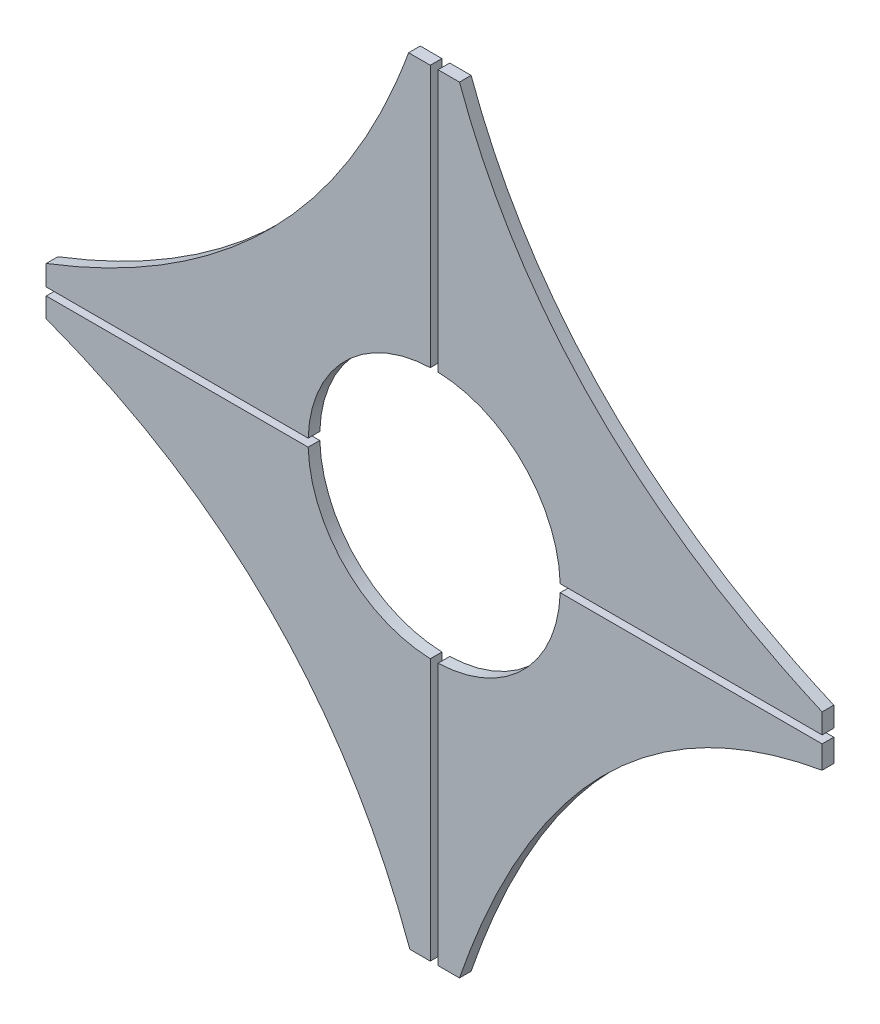
ISO-10303-21;
HEADER;
FILE_DESCRIPTION(('STEP AP214'),'2;1');
FILE_NAME('part.step','',(''),(''),'','','');
FILE_SCHEMA(('AUTOMOTIVE_DESIGN { 1 0 10303 214 1 1 1 1 }'));
ENDSEC;
DATA;
#1=APPLICATION_CONTEXT('core data for automotive mechanical design processes');
#2=APPLICATION_PROTOCOL_DEFINITION('international standard','automotive_design',2000,#1);
#3=PRODUCT_CONTEXT('',#1,'mechanical');
#4=PRODUCT('Part','Part','',(#3));
#5=PRODUCT_RELATED_PRODUCT_CATEGORY('part','',(#4));
#6=PRODUCT_DEFINITION_FORMATION('','',#4);
#7=PRODUCT_DEFINITION_CONTEXT('part definition',#1,'design');
#8=PRODUCT_DEFINITION('design','',#6,#7);
#9=PRODUCT_DEFINITION_SHAPE('','',#8);
#10=(LENGTH_UNIT() NAMED_UNIT(*) SI_UNIT(.MILLI.,.METRE.));
#11=(NAMED_UNIT(*) PLANE_ANGLE_UNIT() SI_UNIT($,.RADIAN.));
#12=(NAMED_UNIT(*) SI_UNIT($,.STERADIAN.) SOLID_ANGLE_UNIT());
#13=UNCERTAINTY_MEASURE_WITH_UNIT(LENGTH_MEASURE(1.E-05),#10,'distance_accuracy_value','');
#14=(GEOMETRIC_REPRESENTATION_CONTEXT(3) GLOBAL_UNCERTAINTY_ASSIGNED_CONTEXT((#13)) GLOBAL_UNIT_ASSIGNED_CONTEXT((#10,
#11,#12)) REPRESENTATION_CONTEXT('',''));
#15=CARTESIAN_POINT('',(0.,0.,0.));
#16=DIRECTION('',(0.,0.,1.));
#17=DIRECTION('',(1.,0.,0.));
#18=AXIS2_PLACEMENT_3D('',#15,#16,#17);
#19=CARTESIAN_POINT('',(-82.7092824955107,-71.5253229127844,3.));
#20=DIRECTION('',(0.,1.,0.));
#21=DIRECTION('',(0.,0.,1.));
#22=AXIS2_PLACEMENT_3D('',#19,#20,#21);
#23=PLANE('',#22);
#24=DIRECTION('',(1.,0.,0.));
#25=VECTOR('',#24,1.);
#26=CARTESIAN_POINT('',(-82.7092824955107,-71.5253229127844,0.));
#27=LINE('',#26,#25);
#28=CARTESIAN_POINT('',(18.2907175044893,-71.5253229127844,0.));
#29=VERTEX_POINT('',#28);
#30=CARTESIAN_POINT('',(23.8097697131968,-71.5253229127844,0.));
#31=VERTEX_POINT('',#30);
#32=EDGE_CURVE('E119',#29,#31,#27,.T.);
#33=ORIENTED_EDGE('',*,*,#32,.T.);
#34=DIRECTION('',(0.,0.,1.));
#35=VECTOR('',#34,1.);
#36=CARTESIAN_POINT('',(23.8097697131968,-71.5253229127844,-7.));
#37=LINE('',#36,#35);
#38=CARTESIAN_POINT('',(23.8097697131968,-71.5253229127844,3.));
#39=VERTEX_POINT('',#38);
#40=EDGE_CURVE('E63',#31,#39,#37,.T.);
#41=ORIENTED_EDGE('',*,*,#40,.T.);
#42=DIRECTION('',(1.,0.,0.));
#43=VECTOR('',#42,1.);
#44=CARTESIAN_POINT('',(-82.7092824955107,-71.5253229127844,3.));
#45=LINE('',#44,#43);
#46=CARTESIAN_POINT('',(18.2907175044893,-71.5253229127844,3.));
#47=VERTEX_POINT('',#46);
#48=EDGE_CURVE('E117',#47,#39,#45,.T.);
#49=ORIENTED_EDGE('',*,*,#48,.F.);
#50=DIRECTION('',(0.,0.,1.));
#51=VECTOR('',#50,1.);
#52=CARTESIAN_POINT('',(18.2907175044893,-71.5253229127844,-7.));
#53=LINE('',#52,#51);
#54=EDGE_CURVE('E94',#29,#47,#53,.T.);
#55=ORIENTED_EDGE('',*,*,#54,.F.);
#56=EDGE_LOOP('',(#33,#41,#49,#55));
#57=FACE_BOUND('',#56,.T.);
#58=ADVANCED_FACE('F48',(#57),#23,.F.);
#59=CARTESIAN_POINT('',(117.290717504489,128.474677087216,3.));
#60=DIRECTION('',(1.,0.,0.));
#61=DIRECTION('',(0.,1.,0.));
#62=AXIS2_PLACEMENT_3D('',#59,#60,#61);
#63=PLANE('',#62);
#64=DIRECTION('',(0.,0.,1.));
#65=VECTOR('',#64,1.);
#66=CARTESIAN_POINT('',(117.290717504489,21.5866219232985,-7.));
#67=LINE('',#66,#65);
#68=CARTESIAN_POINT('',(117.290717504489,21.5866219232985,0.));
#69=VERTEX_POINT('',#68);
#70=CARTESIAN_POINT('',(117.290717504489,21.5866219232985,3.));
#71=VERTEX_POINT('',#70);
#72=EDGE_CURVE('E108',#69,#71,#67,.T.);
#73=ORIENTED_EDGE('',*,*,#72,.F.);
#74=DIRECTION('',(0.,-1.,0.));
#75=VECTOR('',#74,1.);
#76=CARTESIAN_POINT('',(117.290717504489,128.474677087216,0.));
#77=LINE('',#76,#75);
#78=CARTESIAN_POINT('',(117.290717504489,27.4746770872157,0.));
#79=VERTEX_POINT('',#78);
#80=EDGE_CURVE('E123',#79,#69,#77,.T.);
#81=ORIENTED_EDGE('',*,*,#80,.F.);
#82=DIRECTION('',(0.,0.,1.));
#83=VECTOR('',#82,1.);
#84=CARTESIAN_POINT('',(117.290717504489,27.4746770872157,-7.));
#85=LINE('',#84,#83);
#86=CARTESIAN_POINT('',(117.290717504489,27.4746770872157,3.));
#87=VERTEX_POINT('',#86);
#88=EDGE_CURVE('E72',#79,#87,#85,.T.);
#89=ORIENTED_EDGE('',*,*,#88,.T.);
#90=DIRECTION('',(0.,-1.,0.));
#91=VECTOR('',#90,1.);
#92=CARTESIAN_POINT('',(117.290717504489,128.474677087216,3.));
#93=LINE('',#92,#91);
#94=EDGE_CURVE('E124',#87,#71,#93,.T.);
#95=ORIENTED_EDGE('',*,*,#94,.T.);
#96=EDGE_LOOP('',(#73,#81,#89,#95));
#97=FACE_BOUND('',#96,.T.);
#98=ADVANCED_FACE('F155',(#97),#63,.T.);
#99=CARTESIAN_POINT('',(0.,0.,3.));
#100=DIRECTION('',(0.,0.,-1.));
#101=DIRECTION('',(-1.,0.,0.));
#102=AXIS2_PLACEMENT_3D('',#99,#100,#101);
#103=PLANE('',#102);
#104=ORIENTED_EDGE('',*,*,#48,.T.);
#105=CARTESIAN_POINT('',(117.290717504489,21.5866219232985,3.));
#106=CARTESIAN_POINT('',(51.8516741059689,10.0479529803876,3.));
#107=CARTESIAN_POINT('',(23.8097697131967,-71.5253229127845,3.));
#108=B_SPLINE_CURVE_WITH_KNOTS('',2,(#105,#106,#107),.UNSPECIFIED.,.F.,.F.,(3,3),(0.,1.),.UNSPECIFIED.);
#109=EDGE_CURVE('E105',#71,#39,#108,.T.);
#110=ORIENTED_EDGE('',*,*,#109,.F.);
#111=ORIENTED_EDGE('',*,*,#94,.F.);
#112=DIRECTION('',(1.,0.,0.));
#113=VECTOR('',#112,1.);
#114=CARTESIAN_POINT('',(117.290717504489,27.4746770872157,3.));
#115=LINE('',#114,#113);
#116=CARTESIAN_POINT('',(49.7753292460509,27.4746770872156,3.));
#117=VERTEX_POINT('',#116);
#118=EDGE_CURVE('E57',#117,#87,#115,.T.);
#119=ORIENTED_EDGE('',*,*,#118,.F.);
#120=CARTESIAN_POINT('',(17.2907175044893,28.4746770872157,3.));
#121=DIRECTION('',(0.,0.,1.));
#122=DIRECTION('',(1.,0.,0.));
#123=AXIS2_PLACEMENT_3D('',#120,#121,#122);
#124=CIRCLE('',#123,32.5);
#125=CARTESIAN_POINT('',(18.2907175044893,-4.00993465434592,3.));
#126=VERTEX_POINT('',#125);
#127=EDGE_CURVE('E127',#126,#117,#124,.T.);
#128=ORIENTED_EDGE('',*,*,#127,.F.);
#129=DIRECTION('',(0.,1.,0.));
#130=VECTOR('',#129,1.);
#131=CARTESIAN_POINT('',(18.2907175044893,6.09988475740631,3.));
#132=LINE('',#131,#130);
#133=EDGE_CURVE('E96',#47,#126,#132,.T.);
#134=ORIENTED_EDGE('',*,*,#133,.F.);
#135=EDGE_LOOP('',(#104,#110,#111,#119,#128,#134));
#136=FACE_BOUND('',#135,.T.);
#137=ADVANCED_FACE('F121',(#136),#103,.F.);
#138=CARTESIAN_POINT('',(0.,0.,0.));
#139=DIRECTION('',(0.,0.,-1.));
#140=DIRECTION('',(-1.,0.,0.));
#141=AXIS2_PLACEMENT_3D('',#138,#139,#140);
#142=PLANE('',#141);
#143=CARTESIAN_POINT('',(117.290717504489,21.5866219232985,0.));
#144=CARTESIAN_POINT('',(51.8516741059689,10.0479529803876,0.));
#145=CARTESIAN_POINT('',(23.8097697131967,-71.5253229127845,0.));
#146=B_SPLINE_CURVE_WITH_KNOTS('',2,(#143,#144,#145),.UNSPECIFIED.,.F.,.F.,(3,3),(0.,1.),.UNSPECIFIED.);
#147=EDGE_CURVE('E12',#31,#69,#146,.F.);
#148=ORIENTED_EDGE('',*,*,#147,.F.);
#149=ORIENTED_EDGE('',*,*,#32,.F.);
#150=DIRECTION('',(0.,-1.,0.));
#151=VECTOR('',#150,1.);
#152=CARTESIAN_POINT('',(18.2907175044893,0.,0.));
#153=LINE('',#152,#151);
#154=CARTESIAN_POINT('',(18.2907175044893,-4.00993465434592,0.));
#155=VERTEX_POINT('',#154);
#156=EDGE_CURVE('E140',#155,#29,#153,.T.);
#157=ORIENTED_EDGE('',*,*,#156,.F.);
#158=CARTESIAN_POINT('',(17.2907175044893,28.4746770872157,0.));
#159=DIRECTION('',(0.,0.,-1.));
#160=DIRECTION('',(-1.,0.,0.));
#161=AXIS2_PLACEMENT_3D('',#158,#159,#160);
#162=CIRCLE('',#161,32.5);
#163=CARTESIAN_POINT('',(49.7753292460509,27.4746770872156,0.));
#164=VERTEX_POINT('',#163);
#165=EDGE_CURVE('E134',#164,#155,#162,.T.);
#166=ORIENTED_EDGE('',*,*,#165,.F.);
#167=DIRECTION('',(-1.,0.,0.));
#168=VECTOR('',#167,1.);
#169=CARTESIAN_POINT('',(0.,27.4746770872156,0.));
#170=LINE('',#169,#168);
#171=EDGE_CURVE('E145',#79,#164,#170,.T.);
#172=ORIENTED_EDGE('',*,*,#171,.F.);
#173=ORIENTED_EDGE('',*,*,#80,.T.);
#174=EDGE_LOOP('',(#148,#149,#157,#166,#172,#173));
#175=FACE_BOUND('',#174,.T.);
#176=ADVANCED_FACE('F157',(#175),#142,.T.);
#177=CARTESIAN_POINT('',(17.2907175044893,28.4746770872157,-7.));
#178=DIRECTION('',(0.,0.,1.));
#179=DIRECTION('',(1.,0.,0.));
#180=AXIS2_PLACEMENT_3D('',#177,#178,#179);
#181=CYLINDRICAL_SURFACE('',#180,32.5);
#182=ORIENTED_EDGE('',*,*,#127,.T.);
#183=DIRECTION('',(0.,0.,1.));
#184=VECTOR('',#183,1.);
#185=CARTESIAN_POINT('',(49.7753292460509,27.4746770872156,-7.));
#186=LINE('',#185,#184);
#187=EDGE_CURVE('E133',#117,#164,#186,.F.);
#188=ORIENTED_EDGE('',*,*,#187,.T.);
#189=ORIENTED_EDGE('',*,*,#165,.T.);
#190=DIRECTION('',(0.,0.,1.));
#191=VECTOR('',#190,1.);
#192=CARTESIAN_POINT('',(18.2907175044893,-4.00993465434592,-7.));
#193=LINE('',#192,#191);
#194=EDGE_CURVE('E136',#155,#126,#193,.T.);
#195=ORIENTED_EDGE('',*,*,#194,.T.);
#196=EDGE_LOOP('',(#182,#188,#189,#195));
#197=FACE_BOUND('',#196,.T.);
#198=ADVANCED_FACE('F160',(#197),#181,.F.);
#199=CARTESIAN_POINT('',(18.2907175044893,6.09988475740631,-7.));
#200=DIRECTION('',(1.,0.,0.));
#201=DIRECTION('',(0.,1.,0.));
#202=AXIS2_PLACEMENT_3D('',#199,#200,#201);
#203=PLANE('',#202);
#204=ORIENTED_EDGE('',*,*,#156,.T.);
#205=ORIENTED_EDGE('',*,*,#54,.T.);
#206=ORIENTED_EDGE('',*,*,#133,.T.);
#207=ORIENTED_EDGE('',*,*,#194,.F.);
#208=EDGE_LOOP('',(#204,#205,#206,#207));
#209=FACE_BOUND('',#208,.T.);
#210=ADVANCED_FACE('F159',(#209),#203,.F.);
#211=CARTESIAN_POINT('',(117.290717504489,27.4746770872157,-7.));
#212=DIRECTION('',(0.,-1.,0.));
#213=DIRECTION('',(1.,0.,0.));
#214=AXIS2_PLACEMENT_3D('',#211,#212,#213);
#215=PLANE('',#214);
#216=ORIENTED_EDGE('',*,*,#171,.T.);
#217=ORIENTED_EDGE('',*,*,#187,.F.);
#218=ORIENTED_EDGE('',*,*,#118,.T.);
#219=ORIENTED_EDGE('',*,*,#88,.F.);
#220=EDGE_LOOP('',(#216,#217,#218,#219));
#221=FACE_BOUND('',#220,.T.);
#222=ADVANCED_FACE('F152',(#221),#215,.F.);
#223=CARTESIAN_POINT('',(117.290717504489,21.5866219232985,-7.));
#224=CARTESIAN_POINT('',(51.8516741059689,10.0479529803876,-7.));
#225=CARTESIAN_POINT('',(23.8097697131967,-71.5253229127845,-7.));
#226=B_SPLINE_CURVE_WITH_KNOTS('',2,(#223,#224,#225),.UNSPECIFIED.,.F.,.F.,(3,3),(0.,1.),.UNSPECIFIED.);
#227=DIRECTION('',(0.,0.,1.));
#228=VECTOR('',#227,1.);
#229=SURFACE_OF_LINEAR_EXTRUSION('',#226,#228);
#230=ORIENTED_EDGE('',*,*,#147,.T.);
#231=ORIENTED_EDGE('',*,*,#72,.T.);
#232=ORIENTED_EDGE('',*,*,#109,.T.);
#233=ORIENTED_EDGE('',*,*,#40,.F.);
#234=EDGE_LOOP('',(#230,#231,#232,#233));
#235=FACE_BOUND('',#234,.T.);
#236=ADVANCED_FACE('F106',(#235),#229,.F.);
#237=CLOSED_SHELL('',(#58,#98,#137,#176,#198,#210,#222,#236));
#238=MANIFOLD_SOLID_BREP('B2',#237);
#239=CARTESIAN_POINT('',(17.2907175044893,28.4746770872157,-7.));
#240=DIRECTION('',(0.,0.,1.));
#241=DIRECTION('',(1.,0.,0.));
#242=AXIS2_PLACEMENT_3D('',#239,#240,#241);
#243=CYLINDRICAL_SURFACE('',#242,32.5);
#244=CARTESIAN_POINT('',(17.2907175044893,28.4746770872157,0.));
#245=DIRECTION('',(0.,0.,-1.));
#246=DIRECTION('',(-1.,0.,0.));
#247=AXIS2_PLACEMENT_3D('',#244,#245,#246);
#248=CIRCLE('',#247,32.5);
#249=CARTESIAN_POINT('',(16.2907175044893,-4.00993465434592,0.));
#250=VERTEX_POINT('',#249);
#251=CARTESIAN_POINT('',(-15.1938942370723,27.4746770872156,0.));
#252=VERTEX_POINT('',#251);
#253=EDGE_CURVE('E325',#250,#252,#248,.T.);
#254=ORIENTED_EDGE('',*,*,#253,.T.);
#255=DIRECTION('',(0.,0.,1.));
#256=VECTOR('',#255,1.);
#257=CARTESIAN_POINT('',(-15.1938942370723,27.4746770872156,-7.));
#258=LINE('',#257,#256);
#259=CARTESIAN_POINT('',(-15.1938942370723,27.4746770872156,3.));
#260=VERTEX_POINT('',#259);
#261=EDGE_CURVE('E274',#252,#260,#258,.T.);
#262=ORIENTED_EDGE('',*,*,#261,.T.);
#263=CARTESIAN_POINT('',(17.2907175044893,28.4746770872157,3.));
#264=DIRECTION('',(0.,0.,1.));
#265=DIRECTION('',(1.,0.,0.));
#266=AXIS2_PLACEMENT_3D('',#263,#264,#265);
#267=CIRCLE('',#266,32.5);
#268=CARTESIAN_POINT('',(16.2907175044893,-4.00993465434592,3.));
#269=VERTEX_POINT('',#268);
#270=EDGE_CURVE('E310',#260,#269,#267,.T.);
#271=ORIENTED_EDGE('',*,*,#270,.T.);
#272=DIRECTION('',(0.,0.,1.));
#273=VECTOR('',#272,1.);
#274=CARTESIAN_POINT('',(16.2907175044893,-4.00993465434592,-7.));
#275=LINE('',#274,#273);
#276=EDGE_CURVE('E316',#269,#250,#275,.F.);
#277=ORIENTED_EDGE('',*,*,#276,.T.);
#278=EDGE_LOOP('',(#254,#262,#271,#277));
#279=FACE_BOUND('',#278,.T.);
#280=ADVANCED_FACE('F251',(#279),#243,.F.);
#281=CARTESIAN_POINT('',(0.,0.,0.));
#282=DIRECTION('',(0.,0.,-1.));
#283=DIRECTION('',(-1.,0.,0.));
#284=AXIS2_PLACEMENT_3D('',#281,#282,#283);
#285=PLANE('',#284);
#286=CARTESIAN_POINT('',(11.0176672659218,-71.5253229127844,0.));
#287=CARTESIAN_POINT('',(-13.8242119253943,-3.27282077782295,0.));
#288=CARTESIAN_POINT('',(-82.7092824955107,22.3246278337182,0.));
#289=B_SPLINE_CURVE_WITH_KNOTS('',2,(#286,#287,#288),.UNSPECIFIED.,.F.,.F.,(3,3),(0.,1.),.UNSPECIFIED.);
#290=CARTESIAN_POINT('',(-82.7092824955107,22.3246278337182,0.));
#291=VERTEX_POINT('',#290);
#292=CARTESIAN_POINT('',(11.0176672659218,-71.5253229127844,0.));
#293=VERTEX_POINT('',#292);
#294=EDGE_CURVE('E266',#291,#293,#289,.F.);
#295=ORIENTED_EDGE('',*,*,#294,.F.);
#296=DIRECTION('',(0.,-1.,0.));
#297=VECTOR('',#296,1.);
#298=CARTESIAN_POINT('',(-82.7092824955107,128.474677087216,0.));
#299=LINE('',#298,#297);
#300=CARTESIAN_POINT('',(-82.7092824955107,27.4746770872156,0.));
#301=VERTEX_POINT('',#300);
#302=EDGE_CURVE('E318',#301,#291,#299,.T.);
#303=ORIENTED_EDGE('',*,*,#302,.F.);
#304=DIRECTION('',(-1.,0.,0.));
#305=VECTOR('',#304,1.);
#306=CARTESIAN_POINT('',(0.,27.4746770872156,0.));
#307=LINE('',#306,#305);
#308=EDGE_CURVE('E296',#252,#301,#307,.T.);
#309=ORIENTED_EDGE('',*,*,#308,.F.);
#310=ORIENTED_EDGE('',*,*,#253,.F.);
#311=DIRECTION('',(0.,1.,0.));
#312=VECTOR('',#311,1.);
#313=CARTESIAN_POINT('',(16.2907175044893,0.,0.));
#314=LINE('',#313,#312);
#315=CARTESIAN_POINT('',(16.2907175044893,-71.5253229127844,0.));
#316=VERTEX_POINT('',#315);
#317=EDGE_CURVE('E338',#316,#250,#314,.T.);
#318=ORIENTED_EDGE('',*,*,#317,.F.);
#319=DIRECTION('',(1.,0.,0.));
#320=VECTOR('',#319,1.);
#321=CARTESIAN_POINT('',(-82.7092824955107,-71.5253229127844,0.));
#322=LINE('',#321,#320);
#323=EDGE_CURVE('E324',#293,#316,#322,.T.);
#324=ORIENTED_EDGE('',*,*,#323,.F.);
#325=EDGE_LOOP('',(#295,#303,#309,#310,#318,#324));
#326=FACE_BOUND('',#325,.T.);
#327=ADVANCED_FACE('F354',(#326),#285,.T.);
#328=CARTESIAN_POINT('',(0.,0.,3.));
#329=DIRECTION('',(0.,0.,-1.));
#330=DIRECTION('',(-1.,0.,0.));
#331=AXIS2_PLACEMENT_3D('',#328,#329,#330);
#332=PLANE('',#331);
#333=DIRECTION('',(0.,-1.,0.));
#334=VECTOR('',#333,1.);
#335=CARTESIAN_POINT('',(-82.7092824955107,128.474677087216,3.));
#336=LINE('',#335,#334);
#337=CARTESIAN_POINT('',(-82.7092824955107,27.4746770872156,3.));
#338=VERTEX_POINT('',#337);
#339=CARTESIAN_POINT('',(-82.7092824955107,22.3246278337182,3.));
#340=VERTEX_POINT('',#339);
#341=EDGE_CURVE('E307',#338,#340,#336,.T.);
#342=ORIENTED_EDGE('',*,*,#341,.T.);
#343=CARTESIAN_POINT('',(11.0176672659218,-71.5253229127844,3.));
#344=CARTESIAN_POINT('',(-13.8242119253943,-3.27282077782295,3.));
#345=CARTESIAN_POINT('',(-82.7092824955107,22.3246278337182,3.));
#346=B_SPLINE_CURVE_WITH_KNOTS('',2,(#343,#344,#345),.UNSPECIFIED.,.F.,.F.,(3,3),(0.,1.),.UNSPECIFIED.);
#347=CARTESIAN_POINT('',(11.0176672659218,-71.5253229127844,3.));
#348=VERTEX_POINT('',#347);
#349=EDGE_CURVE('E378',#348,#340,#346,.T.);
#350=ORIENTED_EDGE('',*,*,#349,.F.);
#351=DIRECTION('',(1.,0.,0.));
#352=VECTOR('',#351,1.);
#353=CARTESIAN_POINT('',(-82.7092824955107,-71.5253229127844,3.));
#354=LINE('',#353,#352);
#355=CARTESIAN_POINT('',(16.2907175044893,-71.5253229127844,3.));
#356=VERTEX_POINT('',#355);
#357=EDGE_CURVE('E315',#348,#356,#354,.T.);
#358=ORIENTED_EDGE('',*,*,#357,.T.);
#359=DIRECTION('',(0.,-1.,0.));
#360=VECTOR('',#359,1.);
#361=CARTESIAN_POINT('',(16.2907175044893,-71.5253229127844,3.));
#362=LINE('',#361,#360);
#363=EDGE_CURVE('E337',#269,#356,#362,.T.);
#364=ORIENTED_EDGE('',*,*,#363,.F.);
#365=ORIENTED_EDGE('',*,*,#270,.F.);
#366=DIRECTION('',(1.,0.,0.));
#367=VECTOR('',#366,1.);
#368=CARTESIAN_POINT('',(-7.92446103112326,27.4746770872156,3.));
#369=LINE('',#368,#367);
#370=EDGE_CURVE('E259',#338,#260,#369,.T.);
#371=ORIENTED_EDGE('',*,*,#370,.F.);
#372=EDGE_LOOP('',(#342,#350,#358,#364,#365,#371));
#373=FACE_BOUND('',#372,.T.);
#374=ADVANCED_FACE('F253',(#373),#332,.F.);
#375=CARTESIAN_POINT('',(-82.7092824955107,128.474677087216,3.));
#376=DIRECTION('',(1.,0.,0.));
#377=DIRECTION('',(0.,1.,0.));
#378=AXIS2_PLACEMENT_3D('',#375,#376,#377);
#379=PLANE('',#378);
#380=ORIENTED_EDGE('',*,*,#302,.T.);
#381=DIRECTION('',(0.,0.,1.));
#382=VECTOR('',#381,1.);
#383=CARTESIAN_POINT('',(-82.7092824955107,22.3246278337182,-7.));
#384=LINE('',#383,#382);
#385=EDGE_CURVE('E314',#291,#340,#384,.T.);
#386=ORIENTED_EDGE('',*,*,#385,.T.);
#387=ORIENTED_EDGE('',*,*,#341,.F.);
#388=DIRECTION('',(0.,0.,1.));
#389=VECTOR('',#388,1.);
#390=CARTESIAN_POINT('',(-82.7092824955107,27.4746770872156,-7.));
#391=LINE('',#390,#389);
#392=EDGE_CURVE('E293',#301,#338,#391,.T.);
#393=ORIENTED_EDGE('',*,*,#392,.F.);
#394=EDGE_LOOP('',(#380,#386,#387,#393));
#395=FACE_BOUND('',#394,.T.);
#396=ADVANCED_FACE('F313',(#395),#379,.F.);
#397=CARTESIAN_POINT('',(-82.7092824955107,-71.5253229127844,3.));
#398=DIRECTION('',(0.,1.,0.));
#399=DIRECTION('',(0.,0.,1.));
#400=AXIS2_PLACEMENT_3D('',#397,#398,#399);
#401=PLANE('',#400);
#402=ORIENTED_EDGE('',*,*,#357,.F.);
#403=DIRECTION('',(0.,0.,1.));
#404=VECTOR('',#403,1.);
#405=CARTESIAN_POINT('',(11.0176672659218,-71.5253229127844,-7.));
#406=LINE('',#405,#404);
#407=EDGE_CURVE('E46',#348,#293,#406,.F.);
#408=ORIENTED_EDGE('',*,*,#407,.T.);
#409=ORIENTED_EDGE('',*,*,#323,.T.);
#410=DIRECTION('',(0.,0.,1.));
#411=VECTOR('',#410,1.);
#412=CARTESIAN_POINT('',(16.2907175044893,-71.5253229127844,-7.));
#413=LINE('',#412,#411);
#414=EDGE_CURVE('E334',#316,#356,#413,.T.);
#415=ORIENTED_EDGE('',*,*,#414,.T.);
#416=EDGE_LOOP('',(#402,#408,#409,#415));
#417=FACE_BOUND('',#416,.T.);
#418=ADVANCED_FACE('F350',(#417),#401,.F.);
#419=CARTESIAN_POINT('',(16.2907175044893,-71.5253229127844,-7.));
#420=DIRECTION('',(-1.,0.,0.));
#421=DIRECTION('',(0.,0.,1.));
#422=AXIS2_PLACEMENT_3D('',#419,#420,#421);
#423=PLANE('',#422);
#424=ORIENTED_EDGE('',*,*,#317,.T.);
#425=ORIENTED_EDGE('',*,*,#276,.F.);
#426=ORIENTED_EDGE('',*,*,#363,.T.);
#427=ORIENTED_EDGE('',*,*,#414,.F.);
#428=EDGE_LOOP('',(#424,#425,#426,#427));
#429=FACE_BOUND('',#428,.T.);
#430=ADVANCED_FACE('F346',(#429),#423,.F.);
#431=CARTESIAN_POINT('',(-7.92446103112326,27.4746770872156,-7.));
#432=DIRECTION('',(0.,-1.,0.));
#433=DIRECTION('',(1.,0.,0.));
#434=AXIS2_PLACEMENT_3D('',#431,#432,#433);
#435=PLANE('',#434);
#436=ORIENTED_EDGE('',*,*,#308,.T.);
#437=ORIENTED_EDGE('',*,*,#392,.T.);
#438=ORIENTED_EDGE('',*,*,#370,.T.);
#439=ORIENTED_EDGE('',*,*,#261,.F.);
#440=EDGE_LOOP('',(#436,#437,#438,#439));
#441=FACE_BOUND('',#440,.T.);
#442=ADVANCED_FACE('F295',(#441),#435,.F.);
#443=CARTESIAN_POINT('',(11.0176672659218,-71.5253229127844,-7.));
#444=CARTESIAN_POINT('',(-13.8242119253943,-3.27282077782295,-7.));
#445=CARTESIAN_POINT('',(-82.7092824955107,22.3246278337182,-7.));
#446=B_SPLINE_CURVE_WITH_KNOTS('',2,(#443,#444,#445),.UNSPECIFIED.,.F.,.F.,(3,3),(0.,1.),.UNSPECIFIED.);
#447=DIRECTION('',(0.,0.,1.));
#448=VECTOR('',#447,1.);
#449=SURFACE_OF_LINEAR_EXTRUSION('',#446,#448);
#450=ORIENTED_EDGE('',*,*,#294,.T.);
#451=ORIENTED_EDGE('',*,*,#407,.F.);
#452=ORIENTED_EDGE('',*,*,#349,.T.);
#453=ORIENTED_EDGE('',*,*,#385,.F.);
#454=EDGE_LOOP('',(#450,#451,#452,#453));
#455=FACE_BOUND('',#454,.T.);
#456=ADVANCED_FACE('F367',(#455),#449,.F.);
#457=CLOSED_SHELL('',(#280,#327,#374,#396,#418,#430,#442,#456));
#458=MANIFOLD_SOLID_BREP('B6',#457);
#459=CARTESIAN_POINT('',(17.2907175044893,28.4746770872157,-7.));
#460=DIRECTION('',(0.,0.,1.));
#461=DIRECTION('',(1.,0.,0.));
#462=AXIS2_PLACEMENT_3D('',#459,#460,#461);
#463=CYLINDRICAL_SURFACE('',#462,32.5);
#464=CARTESIAN_POINT('',(17.2907175044893,28.4746770872157,3.));
#465=DIRECTION('',(0.,0.,1.));
#466=DIRECTION('',(1.,0.,0.));
#467=AXIS2_PLACEMENT_3D('',#464,#465,#466);
#468=CIRCLE('',#467,32.5);
#469=CARTESIAN_POINT('',(49.7753292460509,29.4746770872157,3.));
#470=VERTEX_POINT('',#469);
#471=CARTESIAN_POINT('',(18.2907175044893,60.9592888287772,3.));
#472=VERTEX_POINT('',#471);
#473=EDGE_CURVE('E538',#470,#472,#468,.T.);
#474=ORIENTED_EDGE('',*,*,#473,.T.);
#475=DIRECTION('',(0.,0.,1.));
#476=VECTOR('',#475,1.);
#477=CARTESIAN_POINT('',(18.2907175044893,60.9592888287772,-7.));
#478=LINE('',#477,#476);
#479=CARTESIAN_POINT('',(18.2907175044893,60.9592888287772,0.));
#480=VERTEX_POINT('',#479);
#481=EDGE_CURVE('E540',#472,#480,#478,.F.);
#482=ORIENTED_EDGE('',*,*,#481,.T.);
#483=CARTESIAN_POINT('',(17.2907175044893,28.4746770872157,0.));
#484=DIRECTION('',(0.,0.,-1.));
#485=DIRECTION('',(-1.,0.,0.));
#486=AXIS2_PLACEMENT_3D('',#483,#484,#485);
#487=CIRCLE('',#486,32.5);
#488=CARTESIAN_POINT('',(49.7753292460509,29.4746770872157,0.));
#489=VERTEX_POINT('',#488);
#490=EDGE_CURVE('E541',#480,#489,#487,.T.);
#491=ORIENTED_EDGE('',*,*,#490,.T.);
#492=DIRECTION('',(0.,0.,1.));
#493=VECTOR('',#492,1.);
#494=CARTESIAN_POINT('',(49.7753292460509,29.4746770872157,-7.));
#495=LINE('',#494,#493);
#496=EDGE_CURVE('E537',#489,#470,#495,.T.);
#497=ORIENTED_EDGE('',*,*,#496,.T.);
#498=EDGE_LOOP('',(#474,#482,#491,#497));
#499=FACE_BOUND('',#498,.T.);
#500=ADVANCED_FACE('F453',(#499),#463,.F.);
#501=CARTESIAN_POINT('',(0.,0.,0.));
#502=DIRECTION('',(0.,0.,-1.));
#503=DIRECTION('',(-1.,0.,0.));
#504=AXIS2_PLACEMENT_3D('',#501,#502,#503);
#505=PLANE('',#504);
#506=CARTESIAN_POINT('',(23.8097697131969,128.474677087216,0.));
#507=CARTESIAN_POINT('',(46.7456405350005,65.4588899087817,0.));
#508=CARTESIAN_POINT('',(117.290717504489,34.6247263407131,0.));
#509=B_SPLINE_CURVE_WITH_KNOTS('',2,(#506,#507,#508),.UNSPECIFIED.,.F.,.F.,(3,3),(0.,1.),.UNSPECIFIED.);
#510=CARTESIAN_POINT('',(117.290717504489,34.6247263407132,0.));
#511=VERTEX_POINT('',#510);
#512=CARTESIAN_POINT('',(23.8097697131969,128.474677087216,0.));
#513=VERTEX_POINT('',#512);
#514=EDGE_CURVE('E515',#511,#513,#509,.F.);
#515=ORIENTED_EDGE('',*,*,#514,.F.);
#516=DIRECTION('',(0.,-1.,0.));
#517=VECTOR('',#516,1.);
#518=CARTESIAN_POINT('',(117.290717504489,128.474677087216,0.));
#519=LINE('',#518,#517);
#520=CARTESIAN_POINT('',(117.290717504489,29.4746770872157,0.));
#521=VERTEX_POINT('',#520);
#522=EDGE_CURVE('E531',#511,#521,#519,.T.);
#523=ORIENTED_EDGE('',*,*,#522,.T.);
#524=DIRECTION('',(1.,0.,0.));
#525=VECTOR('',#524,1.);
#526=CARTESIAN_POINT('',(0.,29.4746770872157,0.));
#527=LINE('',#526,#525);
#528=EDGE_CURVE('E529',#489,#521,#527,.T.);
#529=ORIENTED_EDGE('',*,*,#528,.F.);
#530=ORIENTED_EDGE('',*,*,#490,.F.);
#531=DIRECTION('',(0.,-1.,0.));
#532=VECTOR('',#531,1.);
#533=CARTESIAN_POINT('',(18.2907175044893,0.,0.));
#534=LINE('',#533,#532);
#535=CARTESIAN_POINT('',(18.2907175044893,128.474677087216,0.));
#536=VERTEX_POINT('',#535);
#537=EDGE_CURVE('E553',#536,#480,#534,.T.);
#538=ORIENTED_EDGE('',*,*,#537,.F.);
#539=DIRECTION('',(1.,0.,0.));
#540=VECTOR('',#539,1.);
#541=CARTESIAN_POINT('',(-82.7092824955107,128.474677087216,0.));
#542=LINE('',#541,#540);
#543=EDGE_CURVE('E535',#536,#513,#542,.T.);
#544=ORIENTED_EDGE('',*,*,#543,.T.);
#545=EDGE_LOOP('',(#515,#523,#529,#530,#538,#544));
#546=FACE_BOUND('',#545,.T.);
#547=ADVANCED_FACE('F564',(#546),#505,.T.);
#548=CARTESIAN_POINT('',(0.,0.,3.));
#549=DIRECTION('',(0.,0.,-1.));
#550=DIRECTION('',(-1.,0.,0.));
#551=AXIS2_PLACEMENT_3D('',#548,#549,#550);
#552=PLANE('',#551);
#553=DIRECTION('',(0.,-1.,0.));
#554=VECTOR('',#553,1.);
#555=CARTESIAN_POINT('',(117.290717504489,128.474677087216,3.));
#556=LINE('',#555,#554);
#557=CARTESIAN_POINT('',(117.290717504489,34.6247263407131,3.));
#558=VERTEX_POINT('',#557);
#559=CARTESIAN_POINT('',(117.290717504489,29.4746770872157,3.));
#560=VERTEX_POINT('',#559);
#561=EDGE_CURVE('E498',#558,#560,#556,.T.);
#562=ORIENTED_EDGE('',*,*,#561,.F.);
#563=CARTESIAN_POINT('',(23.8097697131969,128.474677087216,3.));
#564=CARTESIAN_POINT('',(46.7456405350005,65.4588899087817,3.));
#565=CARTESIAN_POINT('',(117.290717504489,34.6247263407131,3.));
#566=B_SPLINE_CURVE_WITH_KNOTS('',2,(#563,#564,#565),.UNSPECIFIED.,.F.,.F.,(3,3),(0.,1.),.UNSPECIFIED.);
#567=CARTESIAN_POINT('',(23.8097697131969,128.474677087216,3.));
#568=VERTEX_POINT('',#567);
#569=EDGE_CURVE('E467',#568,#558,#566,.T.);
#570=ORIENTED_EDGE('',*,*,#569,.F.);
#571=DIRECTION('',(1.,0.,0.));
#572=VECTOR('',#571,1.);
#573=CARTESIAN_POINT('',(-82.7092824955107,128.474677087216,3.));
#574=LINE('',#573,#572);
#575=CARTESIAN_POINT('',(18.2907175044893,128.474677087216,3.));
#576=VERTEX_POINT('',#575);
#577=EDGE_CURVE('E525',#576,#568,#574,.T.);
#578=ORIENTED_EDGE('',*,*,#577,.F.);
#579=DIRECTION('',(0.,1.,0.));
#580=VECTOR('',#579,1.);
#581=CARTESIAN_POINT('',(18.2907175044893,128.474677087216,3.));
#582=LINE('',#581,#580);
#583=EDGE_CURVE('E461',#472,#576,#582,.T.);
#584=ORIENTED_EDGE('',*,*,#583,.F.);
#585=ORIENTED_EDGE('',*,*,#473,.F.);
#586=DIRECTION('',(-1.,0.,0.));
#587=VECTOR('',#586,1.);
#588=CARTESIAN_POINT('',(38.8029988251073,29.4746770872157,3.));
#589=LINE('',#588,#587);
#590=EDGE_CURVE('E503',#560,#470,#589,.T.);
#591=ORIENTED_EDGE('',*,*,#590,.F.);
#592=EDGE_LOOP('',(#562,#570,#578,#584,#585,#591));
#593=FACE_BOUND('',#592,.T.);
#594=ADVANCED_FACE('F523',(#593),#552,.F.);
#595=CARTESIAN_POINT('',(-82.7092824955107,128.474677087216,3.));
#596=DIRECTION('',(0.,1.,0.));
#597=DIRECTION('',(0.,0.,1.));
#598=AXIS2_PLACEMENT_3D('',#595,#596,#597);
#599=PLANE('',#598);
#600=DIRECTION('',(0.,0.,1.));
#601=VECTOR('',#600,1.);
#602=CARTESIAN_POINT('',(23.8097697131969,128.474677087216,-7.));
#603=LINE('',#602,#601);
#604=EDGE_CURVE('E512',#513,#568,#603,.T.);
#605=ORIENTED_EDGE('',*,*,#604,.F.);
#606=ORIENTED_EDGE('',*,*,#543,.F.);
#607=DIRECTION('',(0.,0.,1.));
#608=VECTOR('',#607,1.);
#609=CARTESIAN_POINT('',(18.2907175044893,128.474677087216,-7.));
#610=LINE('',#609,#608);
#611=EDGE_CURVE('E476',#536,#576,#610,.T.);
#612=ORIENTED_EDGE('',*,*,#611,.T.);
#613=ORIENTED_EDGE('',*,*,#577,.T.);
#614=EDGE_LOOP('',(#605,#606,#612,#613));
#615=FACE_BOUND('',#614,.T.);
#616=ADVANCED_FACE('F527',(#615),#599,.T.);
#617=CARTESIAN_POINT('',(117.290717504489,128.474677087216,3.));
#618=DIRECTION('',(1.,0.,0.));
#619=DIRECTION('',(0.,1.,0.));
#620=AXIS2_PLACEMENT_3D('',#617,#618,#619);
#621=PLANE('',#620);
#622=DIRECTION('',(0.,0.,1.));
#623=VECTOR('',#622,1.);
#624=CARTESIAN_POINT('',(117.290717504489,34.6247263407131,-7.));
#625=LINE('',#624,#623);
#626=EDGE_CURVE('E249',#558,#511,#625,.F.);
#627=ORIENTED_EDGE('',*,*,#626,.F.);
#628=ORIENTED_EDGE('',*,*,#561,.T.);
#629=DIRECTION('',(0.,0.,1.));
#630=VECTOR('',#629,1.);
#631=CARTESIAN_POINT('',(117.290717504489,29.4746770872157,-7.));
#632=LINE('',#631,#630);
#633=EDGE_CURVE('E557',#521,#560,#632,.T.);
#634=ORIENTED_EDGE('',*,*,#633,.F.);
#635=ORIENTED_EDGE('',*,*,#522,.F.);
#636=EDGE_LOOP('',(#627,#628,#634,#635));
#637=FACE_BOUND('',#636,.T.);
#638=ADVANCED_FACE('F455',(#637),#621,.T.);
#639=CARTESIAN_POINT('',(38.8029988251073,29.4746770872157,-7.));
#640=DIRECTION('',(0.,1.,0.));
#641=DIRECTION('',(0.,0.,1.));
#642=AXIS2_PLACEMENT_3D('',#639,#640,#641);
#643=PLANE('',#642);
#644=ORIENTED_EDGE('',*,*,#528,.T.);
#645=ORIENTED_EDGE('',*,*,#633,.T.);
#646=ORIENTED_EDGE('',*,*,#590,.T.);
#647=ORIENTED_EDGE('',*,*,#496,.F.);
#648=EDGE_LOOP('',(#644,#645,#646,#647));
#649=FACE_BOUND('',#648,.T.);
#650=ADVANCED_FACE('F559',(#649),#643,.F.);
#651=CARTESIAN_POINT('',(18.2907175044893,128.474677087216,-7.));
#652=DIRECTION('',(1.,0.,0.));
#653=DIRECTION('',(0.,1.,0.));
#654=AXIS2_PLACEMENT_3D('',#651,#652,#653);
#655=PLANE('',#654);
#656=ORIENTED_EDGE('',*,*,#537,.T.);
#657=ORIENTED_EDGE('',*,*,#481,.F.);
#658=ORIENTED_EDGE('',*,*,#583,.T.);
#659=ORIENTED_EDGE('',*,*,#611,.F.);
#660=EDGE_LOOP('',(#656,#657,#658,#659));
#661=FACE_BOUND('',#660,.T.);
#662=ADVANCED_FACE('F570',(#661),#655,.F.);
#663=CARTESIAN_POINT('',(23.8097697131969,128.474677087216,-7.));
#664=CARTESIAN_POINT('',(46.7456405350005,65.4588899087817,-7.));
#665=CARTESIAN_POINT('',(117.290717504489,34.6247263407131,-7.));
#666=B_SPLINE_CURVE_WITH_KNOTS('',2,(#663,#664,#665),.UNSPECIFIED.,.F.,.F.,(3,3),(0.,1.),.UNSPECIFIED.);
#667=DIRECTION('',(0.,0.,1.));
#668=VECTOR('',#667,1.);
#669=SURFACE_OF_LINEAR_EXTRUSION('',#666,#668);
#670=ORIENTED_EDGE('',*,*,#514,.T.);
#671=ORIENTED_EDGE('',*,*,#604,.T.);
#672=ORIENTED_EDGE('',*,*,#569,.T.);
#673=ORIENTED_EDGE('',*,*,#626,.T.);
#674=EDGE_LOOP('',(#670,#671,#672,#673));
#675=FACE_BOUND('',#674,.T.);
#676=ADVANCED_FACE('F513',(#675),#669,.F.);
#677=CLOSED_SHELL('',(#500,#547,#594,#616,#638,#650,#662,#676));
#678=MANIFOLD_SOLID_BREP('B40',#677);
#679=CARTESIAN_POINT('',(17.2907175044893,28.4746770872157,-7.));
#680=DIRECTION('',(0.,0.,1.));
#681=DIRECTION('',(1.,0.,0.));
#682=AXIS2_PLACEMENT_3D('',#679,#680,#681);
#683=CYLINDRICAL_SURFACE('',#682,32.5);
#684=CARTESIAN_POINT('',(17.2907175044893,28.4746770872157,3.));
#685=DIRECTION('',(0.,0.,1.));
#686=DIRECTION('',(1.,0.,0.));
#687=AXIS2_PLACEMENT_3D('',#684,#685,#686);
#688=CIRCLE('',#687,32.5);
#689=CARTESIAN_POINT('',(16.2907175044893,60.9592888287772,3.));
#690=VERTEX_POINT('',#689);
#691=CARTESIAN_POINT('',(-15.1938942370723,29.4746770872157,3.));
#692=VERTEX_POINT('',#691);
#693=EDGE_CURVE('E729',#690,#692,#688,.T.);
#694=ORIENTED_EDGE('',*,*,#693,.T.);
#695=DIRECTION('',(0.,0.,1.));
#696=VECTOR('',#695,1.);
#697=CARTESIAN_POINT('',(-15.1938942370723,29.4746770872157,-7.));
#698=LINE('',#697,#696);
#699=CARTESIAN_POINT('',(-15.1938942370723,29.4746770872157,0.));
#700=VERTEX_POINT('',#699);
#701=EDGE_CURVE('E654',#692,#700,#698,.F.);
#702=ORIENTED_EDGE('',*,*,#701,.T.);
#703=CARTESIAN_POINT('',(17.2907175044893,28.4746770872157,0.));
#704=DIRECTION('',(0.,0.,-1.));
#705=DIRECTION('',(-1.,0.,0.));
#706=AXIS2_PLACEMENT_3D('',#703,#704,#705);
#707=CIRCLE('',#706,32.5);
#708=CARTESIAN_POINT('',(16.2907175044893,60.9592888287772,0.));
#709=VERTEX_POINT('',#708);
#710=EDGE_CURVE('E726',#700,#709,#707,.T.);
#711=ORIENTED_EDGE('',*,*,#710,.T.);
#712=DIRECTION('',(0.,0.,1.));
#713=VECTOR('',#712,1.);
#714=CARTESIAN_POINT('',(16.2907175044893,60.9592888287772,-7.));
#715=LINE('',#714,#713);
#716=EDGE_CURVE('E717',#709,#690,#715,.T.);
#717=ORIENTED_EDGE('',*,*,#716,.T.);
#718=EDGE_LOOP('',(#694,#702,#711,#717));
#719=FACE_BOUND('',#718,.T.);
#720=ADVANCED_FACE('F646',(#719),#683,.F.);
#721=CARTESIAN_POINT('',(0.,0.,0.));
#722=DIRECTION('',(0.,0.,-1.));
#723=DIRECTION('',(-1.,0.,0.));
#724=AXIS2_PLACEMENT_3D('',#721,#722,#723);
#725=PLANE('',#724);
#726=CARTESIAN_POINT('',(-82.7092824955107,34.730552492692,0.));
#727=CARTESIAN_POINT('',(-13.8045665075724,61.1439864519168,0.));
#728=CARTESIAN_POINT('',(10.7018007362623,128.474677087216,0.));
#729=B_SPLINE_CURVE_WITH_KNOTS('',2,(#726,#727,#728),.UNSPECIFIED.,.F.,.F.,(3,3),(0.,1.),.UNSPECIFIED.);
#730=CARTESIAN_POINT('',(10.7018007362623,128.474677087216,0.));
#731=VERTEX_POINT('',#730);
#732=CARTESIAN_POINT('',(-82.7092824955107,34.730552492692,0.));
#733=VERTEX_POINT('',#732);
#734=EDGE_CURVE('E700',#731,#733,#729,.F.);
#735=ORIENTED_EDGE('',*,*,#734,.F.);
#736=DIRECTION('',(1.,0.,0.));
#737=VECTOR('',#736,1.);
#738=CARTESIAN_POINT('',(-82.7092824955107,128.474677087216,0.));
#739=LINE('',#738,#737);
#740=CARTESIAN_POINT('',(16.2907175044893,128.474677087216,0.));
#741=VERTEX_POINT('',#740);
#742=EDGE_CURVE('E724',#731,#741,#739,.T.);
#743=ORIENTED_EDGE('',*,*,#742,.T.);
#744=DIRECTION('',(0.,1.,0.));
#745=VECTOR('',#744,1.);
#746=CARTESIAN_POINT('',(16.2907175044893,0.,0.));
#747=LINE('',#746,#745);
#748=EDGE_CURVE('E742',#709,#741,#747,.T.);
#749=ORIENTED_EDGE('',*,*,#748,.F.);
#750=ORIENTED_EDGE('',*,*,#710,.F.);
#751=DIRECTION('',(1.,0.,0.));
#752=VECTOR('',#751,1.);
#753=CARTESIAN_POINT('',(0.,29.4746770872157,0.));
#754=LINE('',#753,#752);
#755=CARTESIAN_POINT('',(-82.7092824955107,29.4746770872157,0.));
#756=VERTEX_POINT('',#755);
#757=EDGE_CURVE('E740',#756,#700,#754,.T.);
#758=ORIENTED_EDGE('',*,*,#757,.F.);
#759=DIRECTION('',(0.,-1.,0.));
#760=VECTOR('',#759,1.);
#761=CARTESIAN_POINT('',(-82.7092824955107,128.474677087216,0.));
#762=LINE('',#761,#760);
#763=EDGE_CURVE('E720',#733,#756,#762,.T.);
#764=ORIENTED_EDGE('',*,*,#763,.F.);
#765=EDGE_LOOP('',(#735,#743,#749,#750,#758,#764));
#766=FACE_BOUND('',#765,.T.);
#767=ADVANCED_FACE('F739',(#766),#725,.T.);
#768=CARTESIAN_POINT('',(0.,0.,3.));
#769=DIRECTION('',(0.,0.,-1.));
#770=DIRECTION('',(-1.,0.,0.));
#771=AXIS2_PLACEMENT_3D('',#768,#769,#770);
#772=PLANE('',#771);
#773=DIRECTION('',(1.,0.,0.));
#774=VECTOR('',#773,1.);
#775=CARTESIAN_POINT('',(-82.7092824955107,128.474677087216,3.));
#776=LINE('',#775,#774);
#777=CARTESIAN_POINT('',(10.7018007362623,128.474677087216,3.));
#778=VERTEX_POINT('',#777);
#779=CARTESIAN_POINT('',(16.2907175044893,128.474677087216,3.));
#780=VERTEX_POINT('',#779);
#781=EDGE_CURVE('E711',#778,#780,#776,.T.);
#782=ORIENTED_EDGE('',*,*,#781,.F.);
#783=CARTESIAN_POINT('',(-82.7092824955107,34.730552492692,3.));
#784=CARTESIAN_POINT('',(-13.8045665075724,61.1439864519168,3.));
#785=CARTESIAN_POINT('',(10.7018007362623,128.474677087216,3.));
#786=B_SPLINE_CURVE_WITH_KNOTS('',2,(#783,#784,#785),.UNSPECIFIED.,.F.,.F.,(3,3),(0.,1.),.UNSPECIFIED.);
#787=CARTESIAN_POINT('',(-82.7092824955107,34.730552492692,3.));
#788=VERTEX_POINT('',#787);
#789=EDGE_CURVE('E660',#788,#778,#786,.T.);
#790=ORIENTED_EDGE('',*,*,#789,.F.);
#791=DIRECTION('',(0.,-1.,0.));
#792=VECTOR('',#791,1.);
#793=CARTESIAN_POINT('',(-82.7092824955107,128.474677087216,3.));
#794=LINE('',#793,#792);
#795=CARTESIAN_POINT('',(-82.7092824955107,29.4746770872157,3.));
#796=VERTEX_POINT('',#795);
#797=EDGE_CURVE('E709',#788,#796,#794,.T.);
#798=ORIENTED_EDGE('',*,*,#797,.T.);
#799=DIRECTION('',(-1.,0.,0.));
#800=VECTOR('',#799,1.);
#801=CARTESIAN_POINT('',(-82.7092824955107,29.4746770872157,3.));
#802=LINE('',#801,#800);
#803=EDGE_CURVE('E747',#692,#796,#802,.T.);
#804=ORIENTED_EDGE('',*,*,#803,.F.);
#805=ORIENTED_EDGE('',*,*,#693,.F.);
#806=DIRECTION('',(0.,-1.,0.));
#807=VECTOR('',#806,1.);
#808=CARTESIAN_POINT('',(16.2907175044893,53.3052202996425,3.));
#809=LINE('',#808,#807);
#810=EDGE_CURVE('E668',#780,#690,#809,.T.);
#811=ORIENTED_EDGE('',*,*,#810,.F.);
#812=EDGE_LOOP('',(#782,#790,#798,#804,#805,#811));
#813=FACE_BOUND('',#812,.T.);
#814=ADVANCED_FACE('F707',(#813),#772,.F.);
#815=CARTESIAN_POINT('',(-82.7092824955107,128.474677087216,3.));
#816=DIRECTION('',(1.,0.,0.));
#817=DIRECTION('',(0.,1.,0.));
#818=AXIS2_PLACEMENT_3D('',#815,#816,#817);
#819=PLANE('',#818);
#820=ORIENTED_EDGE('',*,*,#797,.F.);
#821=DIRECTION('',(0.,0.,1.));
#822=VECTOR('',#821,1.);
#823=CARTESIAN_POINT('',(-82.7092824955107,34.730552492692,-7.));
#824=LINE('',#823,#822);
#825=EDGE_CURVE('E697',#733,#788,#824,.T.);
#826=ORIENTED_EDGE('',*,*,#825,.F.);
#827=ORIENTED_EDGE('',*,*,#763,.T.);
#828=DIRECTION('',(0.,0.,1.));
#829=VECTOR('',#828,1.);
#830=CARTESIAN_POINT('',(-82.7092824955107,29.4746770872157,-7.));
#831=LINE('',#830,#829);
#832=EDGE_CURVE('E716',#756,#796,#831,.T.);
#833=ORIENTED_EDGE('',*,*,#832,.T.);
#834=EDGE_LOOP('',(#820,#826,#827,#833));
#835=FACE_BOUND('',#834,.T.);
#836=ADVANCED_FACE('F714',(#835),#819,.F.);
#837=CARTESIAN_POINT('',(-82.7092824955107,128.474677087216,3.));
#838=DIRECTION('',(0.,1.,0.));
#839=DIRECTION('',(0.,0.,1.));
#840=AXIS2_PLACEMENT_3D('',#837,#838,#839);
#841=PLANE('',#840);
#842=DIRECTION('',(0.,0.,1.));
#843=VECTOR('',#842,1.);
#844=CARTESIAN_POINT('',(10.7018007362623,128.474677087216,-7.));
#845=LINE('',#844,#843);
#846=EDGE_CURVE('E451',#778,#731,#845,.F.);
#847=ORIENTED_EDGE('',*,*,#846,.F.);
#848=ORIENTED_EDGE('',*,*,#781,.T.);
#849=DIRECTION('',(0.,0.,1.));
#850=VECTOR('',#849,1.);
#851=CARTESIAN_POINT('',(16.2907175044893,128.474677087216,-7.));
#852=LINE('',#851,#850);
#853=EDGE_CURVE('E750',#741,#780,#852,.T.);
#854=ORIENTED_EDGE('',*,*,#853,.F.);
#855=ORIENTED_EDGE('',*,*,#742,.F.);
#856=EDGE_LOOP('',(#847,#848,#854,#855));
#857=FACE_BOUND('',#856,.T.);
#858=ADVANCED_FACE('F648',(#857),#841,.T.);
#859=CARTESIAN_POINT('',(16.2907175044893,53.3052202996425,-7.));
#860=DIRECTION('',(-1.,0.,0.));
#861=DIRECTION('',(0.,0.,1.));
#862=AXIS2_PLACEMENT_3D('',#859,#860,#861);
#863=PLANE('',#862);
#864=ORIENTED_EDGE('',*,*,#748,.T.);
#865=ORIENTED_EDGE('',*,*,#853,.T.);
#866=ORIENTED_EDGE('',*,*,#810,.T.);
#867=ORIENTED_EDGE('',*,*,#716,.F.);
#868=EDGE_LOOP('',(#864,#865,#866,#867));
#869=FACE_BOUND('',#868,.T.);
#870=ADVANCED_FACE('F777',(#869),#863,.F.);
#871=CARTESIAN_POINT('',(-82.7092824955107,29.4746770872157,-7.));
#872=DIRECTION('',(0.,1.,0.));
#873=DIRECTION('',(0.,0.,1.));
#874=AXIS2_PLACEMENT_3D('',#871,#872,#873);
#875=PLANE('',#874);
#876=ORIENTED_EDGE('',*,*,#757,.T.);
#877=ORIENTED_EDGE('',*,*,#701,.F.);
#878=ORIENTED_EDGE('',*,*,#803,.T.);
#879=ORIENTED_EDGE('',*,*,#832,.F.);
#880=EDGE_LOOP('',(#876,#877,#878,#879));
#881=FACE_BOUND('',#880,.T.);
#882=ADVANCED_FACE('F774',(#881),#875,.F.);
#883=CARTESIAN_POINT('',(-82.7092824955107,34.730552492692,-7.));
#884=CARTESIAN_POINT('',(-13.8045665075724,61.1439864519168,-7.));
#885=CARTESIAN_POINT('',(10.7018007362623,128.474677087216,-7.));
#886=B_SPLINE_CURVE_WITH_KNOTS('',2,(#883,#884,#885),.UNSPECIFIED.,.F.,.F.,(3,3),(0.,1.),.UNSPECIFIED.);
#887=DIRECTION('',(0.,0.,1.));
#888=VECTOR('',#887,1.);
#889=SURFACE_OF_LINEAR_EXTRUSION('',#886,#888);
#890=ORIENTED_EDGE('',*,*,#734,.T.);
#891=ORIENTED_EDGE('',*,*,#825,.T.);
#892=ORIENTED_EDGE('',*,*,#789,.T.);
#893=ORIENTED_EDGE('',*,*,#846,.T.);
#894=EDGE_LOOP('',(#890,#891,#892,#893));
#895=FACE_BOUND('',#894,.T.);
#896=ADVANCED_FACE('F698',(#895),#889,.F.);
#897=CLOSED_SHELL('',(#720,#767,#814,#836,#858,#870,#882,#896));
#898=MANIFOLD_SOLID_BREP('B243',#897);
#899=ADVANCED_BREP_SHAPE_REPRESENTATION('',(#18,#238,#458,#678,#898),#14);
#900=SHAPE_DEFINITION_REPRESENTATION(#9,#899);
ENDSEC;
END-ISO-10303-21;
